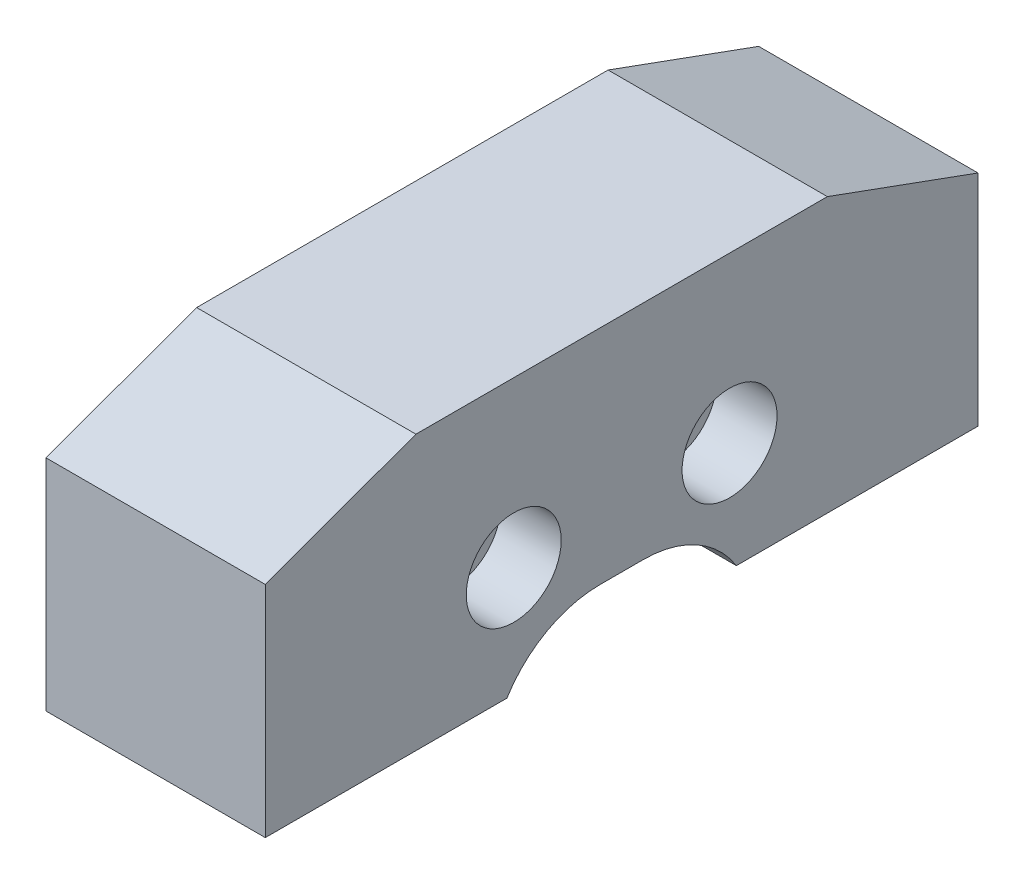
ISO-10303-21;
HEADER;
FILE_DESCRIPTION(('STEP AP214'),'2;1');
FILE_NAME('part.step','',(''),(''),'','','');
FILE_SCHEMA(('AUTOMOTIVE_DESIGN { 1 0 10303 214 1 1 1 1 }'));
ENDSEC;
DATA;
#1=APPLICATION_CONTEXT('core data for automotive mechanical design processes');
#2=APPLICATION_PROTOCOL_DEFINITION('international standard','automotive_design',2000,#1);
#3=PRODUCT_CONTEXT('',#1,'mechanical');
#4=PRODUCT('Part','Part','',(#3));
#5=PRODUCT_RELATED_PRODUCT_CATEGORY('part','',(#4));
#6=PRODUCT_DEFINITION_FORMATION('','',#4);
#7=PRODUCT_DEFINITION_CONTEXT('part definition',#1,'design');
#8=PRODUCT_DEFINITION('design','',#6,#7);
#9=PRODUCT_DEFINITION_SHAPE('','',#8);
#10=(LENGTH_UNIT() NAMED_UNIT(*) SI_UNIT(.MILLI.,.METRE.));
#11=(NAMED_UNIT(*) PLANE_ANGLE_UNIT() SI_UNIT($,.RADIAN.));
#12=(NAMED_UNIT(*) SI_UNIT($,.STERADIAN.) SOLID_ANGLE_UNIT());
#13=UNCERTAINTY_MEASURE_WITH_UNIT(LENGTH_MEASURE(1.E-05),#10,'distance_accuracy_value','');
#14=(GEOMETRIC_REPRESENTATION_CONTEXT(3) GLOBAL_UNCERTAINTY_ASSIGNED_CONTEXT((#13)) GLOBAL_UNIT_ASSIGNED_CONTEXT((#10,
#11,#12)) REPRESENTATION_CONTEXT('',''));
#15=CARTESIAN_POINT('',(0.,0.,0.));
#16=DIRECTION('',(0.,0.,1.));
#17=DIRECTION('',(1.,0.,0.));
#18=AXIS2_PLACEMENT_3D('',#15,#16,#17);
#19=CARTESIAN_POINT('',(12.7,0.,41.275));
#20=DIRECTION('',(0.,1.,0.));
#21=DIRECTION('',(0.,0.,1.));
#22=AXIS2_PLACEMENT_3D('',#19,#20,#21);
#23=PLANE('',#22);
#24=DIRECTION('',(0.,0.,-1.));
#25=VECTOR('',#24,1.);
#26=CARTESIAN_POINT('',(-12.7,0.,41.275));
#27=LINE('',#26,#25);
#28=CARTESIAN_POINT('',(-12.7,0.,41.275));
#29=VERTEX_POINT('',#28);
#30=CARTESIAN_POINT('',(-12.7,0.,13.2888831674089));
#31=VERTEX_POINT('',#30);
#32=EDGE_CURVE('E141',#29,#31,#27,.T.);
#33=ORIENTED_EDGE('',*,*,#32,.T.);
#34=DIRECTION('',(1.,0.,0.));
#35=VECTOR('',#34,1.);
#36=CARTESIAN_POINT('',(-12.7,0.,13.2888831674089));
#37=LINE('',#36,#35);
#38=CARTESIAN_POINT('',(12.7,0.,13.2888831674089));
#39=VERTEX_POINT('',#38);
#40=EDGE_CURVE('E189',#31,#39,#37,.T.);
#41=ORIENTED_EDGE('',*,*,#40,.T.);
#42=DIRECTION('',(0.,0.,-1.));
#43=VECTOR('',#42,1.);
#44=CARTESIAN_POINT('',(12.7,0.,41.275));
#45=LINE('',#44,#43);
#46=CARTESIAN_POINT('',(12.7,0.,41.275));
#47=VERTEX_POINT('',#46);
#48=EDGE_CURVE('E96',#47,#39,#45,.T.);
#49=ORIENTED_EDGE('',*,*,#48,.F.);
#50=DIRECTION('',(-1.,0.,0.));
#51=VECTOR('',#50,1.);
#52=CARTESIAN_POINT('',(12.7,0.,41.275));
#53=LINE('',#52,#51);
#54=EDGE_CURVE('E44',#47,#29,#53,.T.);
#55=ORIENTED_EDGE('',*,*,#54,.T.);
#56=EDGE_LOOP('',(#33,#41,#49,#55));
#57=FACE_BOUND('',#56,.T.);
#58=ADVANCED_FACE('F36',(#57),#23,.F.);
#59=CARTESIAN_POINT('',(12.7,25.4,41.275));
#60=DIRECTION('',(0.,0.,-1.));
#61=DIRECTION('',(-1.,0.,0.));
#62=AXIS2_PLACEMENT_3D('',#59,#60,#61);
#63=PLANE('',#62);
#64=DIRECTION('',(0.,-1.,0.));
#65=VECTOR('',#64,1.);
#66=CARTESIAN_POINT('',(-12.7,25.4,41.275));
#67=LINE('',#66,#65);
#68=CARTESIAN_POINT('',(-12.7,25.4,41.275));
#69=VERTEX_POINT('',#68);
#70=EDGE_CURVE('E136',#69,#29,#67,.T.);
#71=ORIENTED_EDGE('',*,*,#70,.T.);
#72=ORIENTED_EDGE('',*,*,#54,.F.);
#73=DIRECTION('',(0.,-1.,0.));
#74=VECTOR('',#73,1.);
#75=CARTESIAN_POINT('',(12.7,25.4,41.275));
#76=LINE('',#75,#74);
#77=CARTESIAN_POINT('',(12.7,25.4,41.275));
#78=VERTEX_POINT('',#77);
#79=EDGE_CURVE('E150',#78,#47,#76,.T.);
#80=ORIENTED_EDGE('',*,*,#79,.F.);
#81=DIRECTION('',(-1.,0.,0.));
#82=VECTOR('',#81,1.);
#83=CARTESIAN_POINT('',(12.7,25.4,41.275));
#84=LINE('',#83,#82);
#85=EDGE_CURVE('E132',#78,#69,#84,.T.);
#86=ORIENTED_EDGE('',*,*,#85,.T.);
#87=EDGE_LOOP('',(#71,#72,#80,#86));
#88=FACE_BOUND('',#87,.T.);
#89=ADVANCED_FACE('F38',(#88),#63,.F.);
#90=CARTESIAN_POINT('',(12.7,0.,-13.2888831674089));
#91=VERTEX_POINT('',#90);
#92=CARTESIAN_POINT('',(12.7,0.,-41.275));
#93=VERTEX_POINT('',#92);
#94=EDGE_CURVE('E215',#91,#93,#45,.T.);
#95=ORIENTED_EDGE('',*,*,#94,.F.);
#96=DIRECTION('',(1.,0.,0.));
#97=VECTOR('',#96,1.);
#98=CARTESIAN_POINT('',(-12.7,0.,-13.2888831674089));
#99=LINE('',#98,#97);
#100=CARTESIAN_POINT('',(-12.7,0.,-13.2888831674089));
#101=VERTEX_POINT('',#100);
#102=EDGE_CURVE('E185',#91,#101,#99,.F.);
#103=ORIENTED_EDGE('',*,*,#102,.T.);
#104=CARTESIAN_POINT('',(-12.7,0.,-41.275));
#105=VERTEX_POINT('',#104);
#106=EDGE_CURVE('E139',#101,#105,#27,.T.);
#107=ORIENTED_EDGE('',*,*,#106,.T.);
#108=DIRECTION('',(-1.,0.,0.));
#109=VECTOR('',#108,1.);
#110=CARTESIAN_POINT('',(12.7,0.,-41.275));
#111=LINE('',#110,#109);
#112=EDGE_CURVE('E154',#93,#105,#111,.T.);
#113=ORIENTED_EDGE('',*,*,#112,.F.);
#114=EDGE_LOOP('',(#95,#103,#107,#113));
#115=FACE_BOUND('',#114,.T.);
#116=ADVANCED_FACE('F222',(#115),#23,.F.);
#117=CARTESIAN_POINT('',(12.7,0.,-41.275));
#118=DIRECTION('',(0.,0.,1.));
#119=DIRECTION('',(1.,0.,0.));
#120=AXIS2_PLACEMENT_3D('',#117,#118,#119);
#121=PLANE('',#120);
#122=DIRECTION('',(0.,1.,0.));
#123=VECTOR('',#122,1.);
#124=CARTESIAN_POINT('',(-12.7,0.,-41.275));
#125=LINE('',#124,#123);
#126=CARTESIAN_POINT('',(-12.7,25.4,-41.275));
#127=VERTEX_POINT('',#126);
#128=EDGE_CURVE('E144',#105,#127,#125,.T.);
#129=ORIENTED_EDGE('',*,*,#128,.T.);
#130=DIRECTION('',(-1.,0.,0.));
#131=VECTOR('',#130,1.);
#132=CARTESIAN_POINT('',(12.7,25.4,-41.275));
#133=LINE('',#132,#131);
#134=CARTESIAN_POINT('',(12.7,25.4,-41.275));
#135=VERTEX_POINT('',#134);
#136=EDGE_CURVE('E127',#135,#127,#133,.T.);
#137=ORIENTED_EDGE('',*,*,#136,.F.);
#138=DIRECTION('',(0.,1.,0.));
#139=VECTOR('',#138,1.);
#140=CARTESIAN_POINT('',(12.7,0.,-41.275));
#141=LINE('',#140,#139);
#142=EDGE_CURVE('E115',#93,#135,#141,.T.);
#143=ORIENTED_EDGE('',*,*,#142,.F.);
#144=ORIENTED_EDGE('',*,*,#112,.T.);
#145=EDGE_LOOP('',(#129,#137,#143,#144));
#146=FACE_BOUND('',#145,.T.);
#147=ADVANCED_FACE('F226',(#146),#121,.F.);
#148=CARTESIAN_POINT('',(12.7,25.4,-41.275));
#149=DIRECTION('',(0.,-0.93969262078591,0.342020143325663));
#150=DIRECTION('',(0.,-0.342020143325663,-0.939692620785911));
#151=AXIS2_PLACEMENT_3D('',#148,#149,#150);
#152=PLANE('',#151);
#153=DIRECTION('',(0.,0.342020143325663,0.939692620785911));
#154=VECTOR('',#153,1.);
#155=CARTESIAN_POINT('',(-12.7,25.4,-41.275));
#156=LINE('',#155,#154);
#157=CARTESIAN_POINT('',(-12.7,31.75,-23.8285183864628));
#158=VERTEX_POINT('',#157);
#159=EDGE_CURVE('E124',#127,#158,#156,.T.);
#160=ORIENTED_EDGE('',*,*,#159,.T.);
#161=DIRECTION('',(-1.,0.,0.));
#162=VECTOR('',#161,1.);
#163=CARTESIAN_POINT('',(12.7,31.75,-23.8285183864628));
#164=LINE('',#163,#162);
#165=CARTESIAN_POINT('',(12.7,31.75,-23.8285183864628));
#166=VERTEX_POINT('',#165);
#167=EDGE_CURVE('E121',#166,#158,#164,.T.);
#168=ORIENTED_EDGE('',*,*,#167,.F.);
#169=DIRECTION('',(0.,0.342020143325663,0.939692620785911));
#170=VECTOR('',#169,1.);
#171=CARTESIAN_POINT('',(12.7,25.4,-41.275));
#172=LINE('',#171,#170);
#173=EDGE_CURVE('E106',#135,#166,#172,.T.);
#174=ORIENTED_EDGE('',*,*,#173,.F.);
#175=ORIENTED_EDGE('',*,*,#136,.T.);
#176=EDGE_LOOP('',(#160,#168,#174,#175));
#177=FACE_BOUND('',#176,.T.);
#178=ADVANCED_FACE('F122',(#177),#152,.F.);
#179=CARTESIAN_POINT('',(12.7,31.75,-23.8285183864628));
#180=DIRECTION('',(0.,-1.,0.));
#181=DIRECTION('',(0.,0.,-1.));
#182=AXIS2_PLACEMENT_3D('',#179,#180,#181);
#183=PLANE('',#182);
#184=DIRECTION('',(0.,0.,1.));
#185=VECTOR('',#184,1.);
#186=CARTESIAN_POINT('',(-12.7,31.75,-23.8285183864628));
#187=LINE('',#186,#185);
#188=CARTESIAN_POINT('',(-12.7,31.75,23.8285183864628));
#189=VERTEX_POINT('',#188);
#190=EDGE_CURVE('E147',#158,#189,#187,.T.);
#191=ORIENTED_EDGE('',*,*,#190,.T.);
#192=DIRECTION('',(-1.,0.,0.));
#193=VECTOR('',#192,1.);
#194=CARTESIAN_POINT('',(12.7,31.75,23.8285183864628));
#195=LINE('',#194,#193);
#196=CARTESIAN_POINT('',(12.7,31.75,23.8285183864628));
#197=VERTEX_POINT('',#196);
#198=EDGE_CURVE('E128',#197,#189,#195,.T.);
#199=ORIENTED_EDGE('',*,*,#198,.F.);
#200=DIRECTION('',(0.,0.,1.));
#201=VECTOR('',#200,1.);
#202=CARTESIAN_POINT('',(12.7,31.75,-23.8285183864628));
#203=LINE('',#202,#201);
#204=EDGE_CURVE('E112',#166,#197,#203,.T.);
#205=ORIENTED_EDGE('',*,*,#204,.F.);
#206=ORIENTED_EDGE('',*,*,#167,.T.);
#207=EDGE_LOOP('',(#191,#199,#205,#206));
#208=FACE_BOUND('',#207,.T.);
#209=ADVANCED_FACE('F130',(#208),#183,.F.);
#210=CARTESIAN_POINT('',(12.7,31.75,23.8285183864628));
#211=DIRECTION('',(0.,-0.93969262078591,-0.342020143325663));
#212=DIRECTION('',(0.,0.342020143325663,-0.939692620785911));
#213=AXIS2_PLACEMENT_3D('',#210,#211,#212);
#214=PLANE('',#213);
#215=DIRECTION('',(0.,-0.342020143325663,0.939692620785911));
#216=VECTOR('',#215,1.);
#217=CARTESIAN_POINT('',(-12.7,31.75,23.8285183864628));
#218=LINE('',#217,#216);
#219=EDGE_CURVE('E87',#189,#69,#218,.T.);
#220=ORIENTED_EDGE('',*,*,#219,.T.);
#221=ORIENTED_EDGE('',*,*,#85,.F.);
#222=DIRECTION('',(0.,-0.342020143325663,0.939692620785911));
#223=VECTOR('',#222,1.);
#224=CARTESIAN_POINT('',(12.7,31.75,23.8285183864628));
#225=LINE('',#224,#223);
#226=EDGE_CURVE('E60',#197,#78,#225,.T.);
#227=ORIENTED_EDGE('',*,*,#226,.F.);
#228=ORIENTED_EDGE('',*,*,#198,.T.);
#229=EDGE_LOOP('',(#220,#221,#227,#228));
#230=FACE_BOUND('',#229,.T.);
#231=ADVANCED_FACE('F227',(#230),#214,.F.);
#232=CARTESIAN_POINT('',(12.7,0.,0.));
#233=DIRECTION('',(1.,0.,0.));
#234=DIRECTION('',(0.,0.,-1.));
#235=AXIS2_PLACEMENT_3D('',#232,#233,#234);
#236=PLANE('',#235);
#237=CARTESIAN_POINT('',(12.7,-6.7,2.5));
#238=DIRECTION('',(1.,0.,0.));
#239=DIRECTION('',(0.,0.,-1.));
#240=AXIS2_PLACEMENT_3D('',#237,#238,#239);
#241=CIRCLE('',#240,12.7);
#242=CARTESIAN_POINT('',(12.7,6.,2.5));
#243=VERTEX_POINT('',#242);
#244=EDGE_CURVE('E174',#243,#39,#241,.T.);
#245=ORIENTED_EDGE('',*,*,#244,.F.);
#246=DIRECTION('',(0.,0.,1.));
#247=VECTOR('',#246,1.);
#248=CARTESIAN_POINT('',(12.7,6.,-2.5));
#249=LINE('',#248,#247);
#250=CARTESIAN_POINT('',(12.7,6.,-2.5));
#251=VERTEX_POINT('',#250);
#252=EDGE_CURVE('E180',#251,#243,#249,.T.);
#253=ORIENTED_EDGE('',*,*,#252,.F.);
#254=CARTESIAN_POINT('',(12.7,-6.7,-2.5));
#255=DIRECTION('',(1.,0.,0.));
#256=DIRECTION('',(0.,0.,-1.));
#257=AXIS2_PLACEMENT_3D('',#254,#255,#256);
#258=CIRCLE('',#257,12.7);
#259=EDGE_CURVE('E177',#91,#251,#258,.T.);
#260=ORIENTED_EDGE('',*,*,#259,.F.);
#261=ORIENTED_EDGE('',*,*,#94,.T.);
#262=ORIENTED_EDGE('',*,*,#142,.T.);
#263=ORIENTED_EDGE('',*,*,#173,.T.);
#264=ORIENTED_EDGE('',*,*,#204,.T.);
#265=ORIENTED_EDGE('',*,*,#226,.T.);
#266=ORIENTED_EDGE('',*,*,#79,.T.);
#267=ORIENTED_EDGE('',*,*,#48,.T.);
#268=EDGE_LOOP('',(#245,#253,#260,#261,#262,#263,#264,#265,#266,#267));
#269=FACE_BOUND('',#268,.T.);
#270=CARTESIAN_POINT('',(12.7,12.7,12.5));
#271=DIRECTION('',(1.,0.,0.));
#272=DIRECTION('',(0.,0.,-1.));
#273=AXIS2_PLACEMENT_3D('',#270,#271,#272);
#274=CIRCLE('',#273,5.5);
#275=CARTESIAN_POINT('',(12.7,12.7,7.));
#276=VERTEX_POINT('',#275);
#277=EDGE_CURVE('E191',#276,#276,#274,.T.);
#278=ORIENTED_EDGE('',*,*,#277,.F.);
#279=EDGE_LOOP('',(#278));
#280=FACE_BOUND('',#279,.T.);
#281=CARTESIAN_POINT('',(12.7,12.7,-12.5));
#282=DIRECTION('',(1.,0.,0.));
#283=DIRECTION('',(0.,0.,-1.));
#284=AXIS2_PLACEMENT_3D('',#281,#282,#283);
#285=CIRCLE('',#284,5.5);
#286=CARTESIAN_POINT('',(12.7,12.7,-18.));
#287=VERTEX_POINT('',#286);
#288=EDGE_CURVE('E203',#287,#287,#285,.T.);
#289=ORIENTED_EDGE('',*,*,#288,.F.);
#290=EDGE_LOOP('',(#289));
#291=FACE_BOUND('',#290,.T.);
#292=ADVANCED_FACE('F109',(#269,#280,#291),#236,.T.);
#293=CARTESIAN_POINT('',(-12.7,0.,0.));
#294=DIRECTION('',(1.,0.,0.));
#295=DIRECTION('',(0.,0.,-1.));
#296=AXIS2_PLACEMENT_3D('',#293,#294,#295);
#297=PLANE('',#296);
#298=CARTESIAN_POINT('',(-12.7,12.7,12.5));
#299=DIRECTION('',(1.,0.,0.));
#300=DIRECTION('',(0.,0.,-1.));
#301=AXIS2_PLACEMENT_3D('',#298,#299,#300);
#302=CIRCLE('',#301,3.29999999999999);
#303=CARTESIAN_POINT('',(-12.7,12.7,9.2));
#304=VERTEX_POINT('',#303);
#305=EDGE_CURVE('E200',#304,#304,#302,.T.);
#306=ORIENTED_EDGE('',*,*,#305,.T.);
#307=EDGE_LOOP('',(#306));
#308=FACE_BOUND('',#307,.T.);
#309=CARTESIAN_POINT('',(-12.7,12.7,-12.5));
#310=DIRECTION('',(1.,0.,0.));
#311=DIRECTION('',(0.,0.,-1.));
#312=AXIS2_PLACEMENT_3D('',#309,#310,#311);
#313=CIRCLE('',#312,3.29999999999999);
#314=CARTESIAN_POINT('',(-12.7,12.7,-15.8));
#315=VERTEX_POINT('',#314);
#316=EDGE_CURVE('E140',#315,#315,#313,.T.);
#317=ORIENTED_EDGE('',*,*,#316,.T.);
#318=EDGE_LOOP('',(#317));
#319=FACE_BOUND('',#318,.T.);
#320=DIRECTION('',(0.,0.,1.));
#321=VECTOR('',#320,1.);
#322=CARTESIAN_POINT('',(-12.7,6.,-2.5));
#323=LINE('',#322,#321);
#324=CARTESIAN_POINT('',(-12.7,6.,-2.5));
#325=VERTEX_POINT('',#324);
#326=CARTESIAN_POINT('',(-12.7,6.,2.5));
#327=VERTEX_POINT('',#326);
#328=EDGE_CURVE('E51',#325,#327,#323,.T.);
#329=ORIENTED_EDGE('',*,*,#328,.T.);
#330=CARTESIAN_POINT('',(-12.7,-6.7,2.5));
#331=DIRECTION('',(1.,0.,0.));
#332=DIRECTION('',(0.,0.,-1.));
#333=AXIS2_PLACEMENT_3D('',#330,#331,#332);
#334=CIRCLE('',#333,12.7);
#335=EDGE_CURVE('E164',#327,#31,#334,.T.);
#336=ORIENTED_EDGE('',*,*,#335,.T.);
#337=ORIENTED_EDGE('',*,*,#32,.F.);
#338=ORIENTED_EDGE('',*,*,#70,.F.);
#339=ORIENTED_EDGE('',*,*,#219,.F.);
#340=ORIENTED_EDGE('',*,*,#190,.F.);
#341=ORIENTED_EDGE('',*,*,#159,.F.);
#342=ORIENTED_EDGE('',*,*,#128,.F.);
#343=ORIENTED_EDGE('',*,*,#106,.F.);
#344=CARTESIAN_POINT('',(-12.7,-6.7,-2.5));
#345=DIRECTION('',(1.,0.,0.));
#346=DIRECTION('',(0.,0.,-1.));
#347=AXIS2_PLACEMENT_3D('',#344,#345,#346);
#348=CIRCLE('',#347,12.7);
#349=EDGE_CURVE('E11',#101,#325,#348,.T.);
#350=ORIENTED_EDGE('',*,*,#349,.T.);
#351=EDGE_LOOP('',(#329,#336,#337,#338,#339,#340,#341,#342,#343,#350));
#352=FACE_BOUND('',#351,.T.);
#353=ADVANCED_FACE('F161',(#308,#319,#352),#297,.F.);
#354=CARTESIAN_POINT('',(12.7,12.7,-12.5));
#355=DIRECTION('',(1.,0.,0.));
#356=DIRECTION('',(0.,0.,-1.));
#357=AXIS2_PLACEMENT_3D('',#354,#355,#356);
#358=CYLINDRICAL_SURFACE('',#357,3.3);
#359=ORIENTED_EDGE('',*,*,#316,.F.);
#360=EDGE_LOOP('',(#359));
#361=FACE_BOUND('',#360,.T.);
#362=CARTESIAN_POINT('',(5.7,12.7,-12.5));
#363=DIRECTION('',(1.,0.,0.));
#364=DIRECTION('',(0.,0.,-1.));
#365=AXIS2_PLACEMENT_3D('',#362,#363,#364);
#366=CIRCLE('',#365,3.3);
#367=CARTESIAN_POINT('',(5.7,12.7,-15.8));
#368=VERTEX_POINT('',#367);
#369=EDGE_CURVE('E209',#368,#368,#366,.T.);
#370=ORIENTED_EDGE('',*,*,#369,.T.);
#371=EDGE_LOOP('',(#370));
#372=FACE_BOUND('',#371,.T.);
#373=ADVANCED_FACE('F266',(#361,#372),#358,.F.);
#374=CARTESIAN_POINT('',(5.7,16.,-12.5));
#375=DIRECTION('',(-1.,0.,0.));
#376=DIRECTION('',(0.,0.,1.));
#377=AXIS2_PLACEMENT_3D('',#374,#375,#376);
#378=PLANE('',#377);
#379=ORIENTED_EDGE('',*,*,#369,.F.);
#380=EDGE_LOOP('',(#379));
#381=FACE_BOUND('',#380,.T.);
#382=CARTESIAN_POINT('',(5.7,12.7,-12.5));
#383=DIRECTION('',(1.,0.,0.));
#384=DIRECTION('',(0.,0.,-1.));
#385=AXIS2_PLACEMENT_3D('',#382,#383,#384);
#386=CIRCLE('',#385,5.5);
#387=CARTESIAN_POINT('',(5.7,12.7,-18.));
#388=VERTEX_POINT('',#387);
#389=EDGE_CURVE('E206',#388,#388,#386,.T.);
#390=ORIENTED_EDGE('',*,*,#389,.T.);
#391=EDGE_LOOP('',(#390));
#392=FACE_BOUND('',#391,.T.);
#393=ADVANCED_FACE('F271',(#381,#392),#378,.F.);
#394=CARTESIAN_POINT('',(12.7,12.7,-12.5));
#395=DIRECTION('',(1.,0.,0.));
#396=DIRECTION('',(0.,0.,-1.));
#397=AXIS2_PLACEMENT_3D('',#394,#395,#396);
#398=CYLINDRICAL_SURFACE('',#397,5.5);
#399=ORIENTED_EDGE('',*,*,#389,.F.);
#400=EDGE_LOOP('',(#399));
#401=FACE_BOUND('',#400,.T.);
#402=ORIENTED_EDGE('',*,*,#288,.T.);
#403=EDGE_LOOP('',(#402));
#404=FACE_BOUND('',#403,.T.);
#405=ADVANCED_FACE('F283',(#401,#404),#398,.F.);
#406=CARTESIAN_POINT('',(12.7,12.7,12.5));
#407=DIRECTION('',(1.,0.,0.));
#408=DIRECTION('',(0.,0.,-1.));
#409=AXIS2_PLACEMENT_3D('',#406,#407,#408);
#410=CYLINDRICAL_SURFACE('',#409,3.3);
#411=ORIENTED_EDGE('',*,*,#305,.F.);
#412=EDGE_LOOP('',(#411));
#413=FACE_BOUND('',#412,.T.);
#414=CARTESIAN_POINT('',(5.7,12.7,12.5));
#415=DIRECTION('',(1.,0.,0.));
#416=DIRECTION('',(0.,0.,-1.));
#417=AXIS2_PLACEMENT_3D('',#414,#415,#416);
#418=CIRCLE('',#417,3.3);
#419=CARTESIAN_POINT('',(5.7,12.7,9.2));
#420=VERTEX_POINT('',#419);
#421=EDGE_CURVE('E197',#420,#420,#418,.T.);
#422=ORIENTED_EDGE('',*,*,#421,.T.);
#423=EDGE_LOOP('',(#422));
#424=FACE_BOUND('',#423,.T.);
#425=ADVANCED_FACE('F293',(#413,#424),#410,.F.);
#426=CARTESIAN_POINT('',(5.7,16.,12.5));
#427=DIRECTION('',(-1.,0.,0.));
#428=DIRECTION('',(0.,0.,1.));
#429=AXIS2_PLACEMENT_3D('',#426,#427,#428);
#430=PLANE('',#429);
#431=ORIENTED_EDGE('',*,*,#421,.F.);
#432=EDGE_LOOP('',(#431));
#433=FACE_BOUND('',#432,.T.);
#434=CARTESIAN_POINT('',(5.7,12.7,12.5));
#435=DIRECTION('',(1.,0.,0.));
#436=DIRECTION('',(0.,0.,-1.));
#437=AXIS2_PLACEMENT_3D('',#434,#435,#436);
#438=CIRCLE('',#437,5.5);
#439=CARTESIAN_POINT('',(5.7,12.7,7.));
#440=VERTEX_POINT('',#439);
#441=EDGE_CURVE('E194',#440,#440,#438,.T.);
#442=ORIENTED_EDGE('',*,*,#441,.T.);
#443=EDGE_LOOP('',(#442));
#444=FACE_BOUND('',#443,.T.);
#445=ADVANCED_FACE('F303',(#433,#444),#430,.F.);
#446=CARTESIAN_POINT('',(12.7,12.7,12.5));
#447=DIRECTION('',(1.,0.,0.));
#448=DIRECTION('',(0.,0.,-1.));
#449=AXIS2_PLACEMENT_3D('',#446,#447,#448);
#450=CYLINDRICAL_SURFACE('',#449,5.5);
#451=ORIENTED_EDGE('',*,*,#441,.F.);
#452=EDGE_LOOP('',(#451));
#453=FACE_BOUND('',#452,.T.);
#454=ORIENTED_EDGE('',*,*,#277,.T.);
#455=EDGE_LOOP('',(#454));
#456=FACE_BOUND('',#455,.T.);
#457=ADVANCED_FACE('F313',(#453,#456),#450,.F.);
#458=CARTESIAN_POINT('',(-12.7,-6.7,2.5));
#459=DIRECTION('',(1.,0.,0.));
#460=DIRECTION('',(0.,0.,-1.));
#461=AXIS2_PLACEMENT_3D('',#458,#459,#460);
#462=CYLINDRICAL_SURFACE('',#461,12.7);
#463=ORIENTED_EDGE('',*,*,#335,.F.);
#464=DIRECTION('',(1.,0.,0.));
#465=VECTOR('',#464,1.);
#466=CARTESIAN_POINT('',(-12.7,6.,2.5));
#467=LINE('',#466,#465);
#468=EDGE_CURVE('E172',#327,#243,#467,.T.);
#469=ORIENTED_EDGE('',*,*,#468,.T.);
#470=ORIENTED_EDGE('',*,*,#244,.T.);
#471=ORIENTED_EDGE('',*,*,#40,.F.);
#472=EDGE_LOOP('',(#463,#469,#470,#471));
#473=FACE_BOUND('',#472,.T.);
#474=ADVANCED_FACE('F322',(#473),#462,.F.);
#475=CARTESIAN_POINT('',(-12.7,-6.7,-2.5));
#476=DIRECTION('',(1.,0.,0.));
#477=DIRECTION('',(0.,0.,-1.));
#478=AXIS2_PLACEMENT_3D('',#475,#476,#477);
#479=CYLINDRICAL_SURFACE('',#478,12.7);
#480=ORIENTED_EDGE('',*,*,#259,.T.);
#481=DIRECTION('',(1.,0.,0.));
#482=VECTOR('',#481,1.);
#483=CARTESIAN_POINT('',(-12.7,6.,-2.5));
#484=LINE('',#483,#482);
#485=EDGE_CURVE('E170',#325,#251,#484,.T.);
#486=ORIENTED_EDGE('',*,*,#485,.F.);
#487=ORIENTED_EDGE('',*,*,#349,.F.);
#488=ORIENTED_EDGE('',*,*,#102,.F.);
#489=EDGE_LOOP('',(#480,#486,#487,#488));
#490=FACE_BOUND('',#489,.T.);
#491=ADVANCED_FACE('F354',(#490),#479,.F.);
#492=CARTESIAN_POINT('',(-12.7,6.,-2.5));
#493=DIRECTION('',(0.,1.,0.));
#494=DIRECTION('',(0.,0.,1.));
#495=AXIS2_PLACEMENT_3D('',#492,#493,#494);
#496=PLANE('',#495);
#497=ORIENTED_EDGE('',*,*,#252,.T.);
#498=ORIENTED_EDGE('',*,*,#468,.F.);
#499=ORIENTED_EDGE('',*,*,#328,.F.);
#500=ORIENTED_EDGE('',*,*,#485,.T.);
#501=EDGE_LOOP('',(#497,#498,#499,#500));
#502=FACE_BOUND('',#501,.T.);
#503=ADVANCED_FACE('F363',(#502),#496,.F.);
#504=CLOSED_SHELL('',(#58,#89,#116,#147,#178,#209,#231,#292,#353,#373,#393,#405,#425,#445,#457,
#474,#491,#503));
#505=MANIFOLD_SOLID_BREP('B2',#504);
#506=ADVANCED_BREP_SHAPE_REPRESENTATION('',(#18,#505),#14);
#507=SHAPE_DEFINITION_REPRESENTATION(#9,#506);
ENDSEC;
END-ISO-10303-21;
